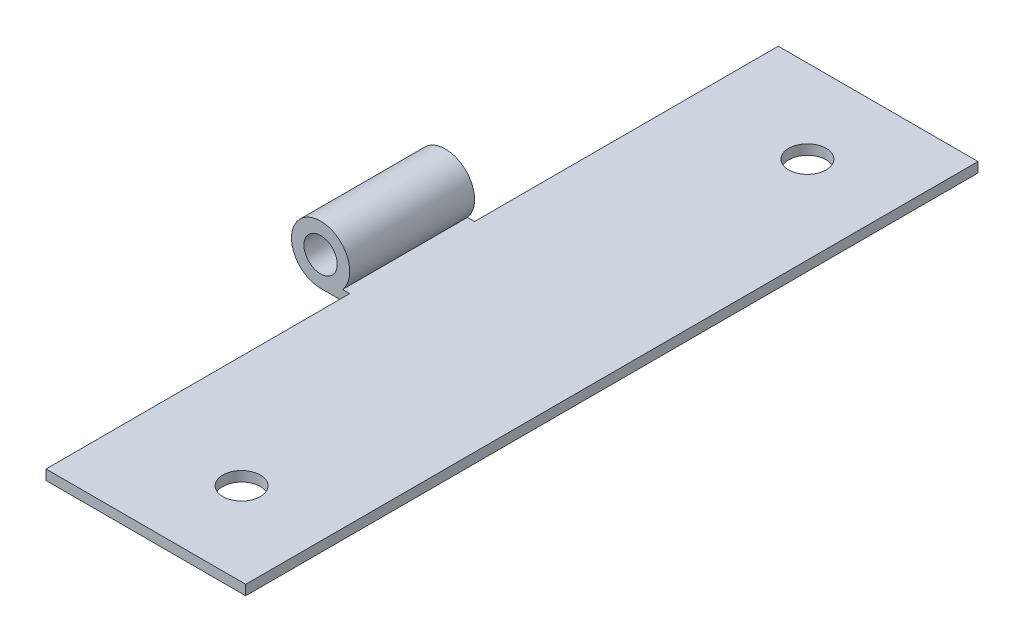
ISO-10303-21;
HEADER;
FILE_DESCRIPTION(('STEP AP214'),'2;1');
FILE_NAME('part.step','',(''),(''),'','','');
FILE_SCHEMA(('AUTOMOTIVE_DESIGN { 1 0 10303 214 1 1 1 1 }'));
ENDSEC;
DATA;
#1=APPLICATION_CONTEXT('core data for automotive mechanical design processes');
#2=APPLICATION_PROTOCOL_DEFINITION('international standard','automotive_design',2000,#1);
#3=PRODUCT_CONTEXT('',#1,'mechanical');
#4=PRODUCT('Part','Part','',(#3));
#5=PRODUCT_RELATED_PRODUCT_CATEGORY('part','',(#4));
#6=PRODUCT_DEFINITION_FORMATION('','',#4);
#7=PRODUCT_DEFINITION_CONTEXT('part definition',#1,'design');
#8=PRODUCT_DEFINITION('design','',#6,#7);
#9=PRODUCT_DEFINITION_SHAPE('','',#8);
#10=(LENGTH_UNIT() NAMED_UNIT(*) SI_UNIT(.MILLI.,.METRE.));
#11=(NAMED_UNIT(*) PLANE_ANGLE_UNIT() SI_UNIT($,.RADIAN.));
#12=(NAMED_UNIT(*) SI_UNIT($,.STERADIAN.) SOLID_ANGLE_UNIT());
#13=UNCERTAINTY_MEASURE_WITH_UNIT(LENGTH_MEASURE(1.E-05),#10,'distance_accuracy_value','');
#14=(GEOMETRIC_REPRESENTATION_CONTEXT(3) GLOBAL_UNCERTAINTY_ASSIGNED_CONTEXT((#13)) GLOBAL_UNIT_ASSIGNED_CONTEXT((#10,
#11,#12)) REPRESENTATION_CONTEXT('',''));
#15=CARTESIAN_POINT('',(0.,0.,0.));
#16=DIRECTION('',(0.,0.,1.));
#17=DIRECTION('',(1.,0.,0.));
#18=AXIS2_PLACEMENT_3D('',#15,#16,#17);
#19=CARTESIAN_POINT('',(-12.,1.2,44.));
#20=DIRECTION('',(1.,0.,0.));
#21=DIRECTION('',(0.,0.,-1.));
#22=AXIS2_PLACEMENT_3D('',#19,#20,#21);
#23=PLANE('',#22);
#24=DIRECTION('',(0.,1.,0.));
#25=VECTOR('',#24,1.);
#26=CARTESIAN_POINT('',(-12.,1.2,-7.5));
#27=LINE('',#26,#25);
#28=CARTESIAN_POINT('',(-12.,0.,-7.5));
#29=VERTEX_POINT('',#28);
#30=CARTESIAN_POINT('',(-12.,1.2,-7.5));
#31=VERTEX_POINT('',#30);
#32=EDGE_CURVE('E56',#29,#31,#27,.T.);
#33=ORIENTED_EDGE('',*,*,#32,.T.);
#34=DIRECTION('',(0.,0.,1.));
#35=VECTOR('',#34,1.);
#36=CARTESIAN_POINT('',(-12.,1.2,44.));
#37=LINE('',#36,#35);
#38=CARTESIAN_POINT('',(-12.,1.2,-44.));
#39=VERTEX_POINT('',#38);
#40=EDGE_CURVE('E143',#39,#31,#37,.T.);
#41=ORIENTED_EDGE('',*,*,#40,.F.);
#42=DIRECTION('',(0.,-1.,0.));
#43=VECTOR('',#42,1.);
#44=CARTESIAN_POINT('',(-12.,1.2,-44.));
#45=LINE('',#44,#43);
#46=CARTESIAN_POINT('',(-12.,0.,-44.));
#47=VERTEX_POINT('',#46);
#48=EDGE_CURVE('E41',#39,#47,#45,.T.);
#49=ORIENTED_EDGE('',*,*,#48,.T.);
#50=DIRECTION('',(0.,0.,1.));
#51=VECTOR('',#50,1.);
#52=CARTESIAN_POINT('',(-12.,0.,44.));
#53=LINE('',#52,#51);
#54=EDGE_CURVE('E153',#47,#29,#53,.T.);
#55=ORIENTED_EDGE('',*,*,#54,.T.);
#56=EDGE_LOOP('',(#33,#41,#49,#55));
#57=FACE_BOUND('',#56,.T.);
#58=ADVANCED_FACE('F33',(#57),#23,.F.);
#59=CARTESIAN_POINT('',(12.,1.2,44.));
#60=DIRECTION('',(-1.,0.,0.));
#61=DIRECTION('',(0.,0.,1.));
#62=AXIS2_PLACEMENT_3D('',#59,#60,#61);
#63=PLANE('',#62);
#64=DIRECTION('',(0.,0.,-1.));
#65=VECTOR('',#64,1.);
#66=CARTESIAN_POINT('',(12.,0.,44.));
#67=LINE('',#66,#65);
#68=CARTESIAN_POINT('',(12.,0.,44.));
#69=VERTEX_POINT('',#68);
#70=CARTESIAN_POINT('',(12.,0.,-44.));
#71=VERTEX_POINT('',#70);
#72=EDGE_CURVE('E118',#69,#71,#67,.T.);
#73=ORIENTED_EDGE('',*,*,#72,.T.);
#74=DIRECTION('',(0.,-1.,0.));
#75=VECTOR('',#74,1.);
#76=CARTESIAN_POINT('',(12.,1.2,-44.));
#77=LINE('',#76,#75);
#78=CARTESIAN_POINT('',(12.,1.2,-44.));
#79=VERTEX_POINT('',#78);
#80=EDGE_CURVE('E11',#79,#71,#77,.T.);
#81=ORIENTED_EDGE('',*,*,#80,.F.);
#82=DIRECTION('',(0.,0.,-1.));
#83=VECTOR('',#82,1.);
#84=CARTESIAN_POINT('',(12.,1.2,44.));
#85=LINE('',#84,#83);
#86=CARTESIAN_POINT('',(12.,1.2,44.));
#87=VERTEX_POINT('',#86);
#88=EDGE_CURVE('E138',#87,#79,#85,.T.);
#89=ORIENTED_EDGE('',*,*,#88,.F.);
#90=DIRECTION('',(0.,-1.,0.));
#91=VECTOR('',#90,1.);
#92=CARTESIAN_POINT('',(12.,1.2,44.));
#93=LINE('',#92,#91);
#94=EDGE_CURVE('E147',#87,#69,#93,.T.);
#95=ORIENTED_EDGE('',*,*,#94,.T.);
#96=EDGE_LOOP('',(#73,#81,#89,#95));
#97=FACE_BOUND('',#96,.T.);
#98=ADVANCED_FACE('F35',(#97),#63,.F.);
#99=CARTESIAN_POINT('',(-12.,1.2,-44.));
#100=DIRECTION('',(0.,0.,1.));
#101=DIRECTION('',(1.,0.,0.));
#102=AXIS2_PLACEMENT_3D('',#99,#100,#101);
#103=PLANE('',#102);
#104=DIRECTION('',(-1.,0.,0.));
#105=VECTOR('',#104,1.);
#106=CARTESIAN_POINT('',(-12.,0.,-44.));
#107=LINE('',#106,#105);
#108=EDGE_CURVE('E150',#71,#47,#107,.T.);
#109=ORIENTED_EDGE('',*,*,#108,.T.);
#110=ORIENTED_EDGE('',*,*,#48,.F.);
#111=DIRECTION('',(-1.,0.,0.));
#112=VECTOR('',#111,1.);
#113=CARTESIAN_POINT('',(-12.,1.2,-44.));
#114=LINE('',#113,#112);
#115=EDGE_CURVE('E140',#79,#39,#114,.T.);
#116=ORIENTED_EDGE('',*,*,#115,.F.);
#117=ORIENTED_EDGE('',*,*,#80,.T.);
#118=EDGE_LOOP('',(#109,#110,#116,#117));
#119=FACE_BOUND('',#118,.T.);
#120=ADVANCED_FACE('F222',(#119),#103,.F.);
#121=CARTESIAN_POINT('',(-12.,1.2,7.5));
#122=VERTEX_POINT('',#121);
#123=CARTESIAN_POINT('',(-12.,1.2,44.));
#124=VERTEX_POINT('',#123);
#125=EDGE_CURVE('E48',#122,#124,#37,.T.);
#126=ORIENTED_EDGE('',*,*,#125,.F.);
#127=DIRECTION('',(0.,1.,0.));
#128=VECTOR('',#127,1.);
#129=CARTESIAN_POINT('',(-12.,1.2,7.5));
#130=LINE('',#129,#128);
#131=CARTESIAN_POINT('',(-12.,0.,7.5));
#132=VERTEX_POINT('',#131);
#133=EDGE_CURVE('E107',#132,#122,#130,.T.);
#134=ORIENTED_EDGE('',*,*,#133,.F.);
#135=CARTESIAN_POINT('',(-12.,0.,44.));
#136=VERTEX_POINT('',#135);
#137=EDGE_CURVE('E152',#132,#136,#53,.T.);
#138=ORIENTED_EDGE('',*,*,#137,.T.);
#139=DIRECTION('',(0.,-1.,0.));
#140=VECTOR('',#139,1.);
#141=CARTESIAN_POINT('',(-12.,1.2,44.));
#142=LINE('',#141,#140);
#143=EDGE_CURVE('E158',#124,#136,#142,.T.);
#144=ORIENTED_EDGE('',*,*,#143,.F.);
#145=EDGE_LOOP('',(#126,#134,#138,#144));
#146=FACE_BOUND('',#145,.T.);
#147=ADVANCED_FACE('F218',(#146),#23,.F.);
#148=CARTESIAN_POINT('',(-12.,1.2,44.));
#149=DIRECTION('',(0.,0.,-1.));
#150=DIRECTION('',(-1.,0.,0.));
#151=AXIS2_PLACEMENT_3D('',#148,#149,#150);
#152=PLANE('',#151);
#153=DIRECTION('',(1.,0.,0.));
#154=VECTOR('',#153,1.);
#155=CARTESIAN_POINT('',(-12.,0.,44.));
#156=LINE('',#155,#154);
#157=EDGE_CURVE('E141',#136,#69,#156,.T.);
#158=ORIENTED_EDGE('',*,*,#157,.T.);
#159=ORIENTED_EDGE('',*,*,#94,.F.);
#160=DIRECTION('',(1.,0.,0.));
#161=VECTOR('',#160,1.);
#162=CARTESIAN_POINT('',(-12.,1.2,44.));
#163=LINE('',#162,#161);
#164=EDGE_CURVE('E145',#124,#87,#163,.T.);
#165=ORIENTED_EDGE('',*,*,#164,.F.);
#166=ORIENTED_EDGE('',*,*,#143,.T.);
#167=EDGE_LOOP('',(#158,#159,#165,#166));
#168=FACE_BOUND('',#167,.T.);
#169=ADVANCED_FACE('F198',(#168),#152,.F.);
#170=CARTESIAN_POINT('',(0.,1.2,0.));
#171=DIRECTION('',(0.,-1.,0.));
#172=DIRECTION('',(0.,0.,-1.));
#173=AXIS2_PLACEMENT_3D('',#170,#171,#172);
#174=PLANE('',#173);
#175=CARTESIAN_POINT('',(1.5,1.2,-34.));
#176=DIRECTION('',(0.,1.,0.));
#177=DIRECTION('',(0.,0.,1.));
#178=AXIS2_PLACEMENT_3D('',#175,#176,#177);
#179=CIRCLE('',#178,2.25);
#180=CARTESIAN_POINT('',(1.5,1.2,-31.75));
#181=VERTEX_POINT('',#180);
#182=EDGE_CURVE('E182',#181,#181,#179,.T.);
#183=ORIENTED_EDGE('',*,*,#182,.F.);
#184=EDGE_LOOP('',(#183));
#185=FACE_BOUND('',#184,.T.);
#186=CARTESIAN_POINT('',(1.5,1.2,34.));
#187=DIRECTION('',(0.,1.,0.));
#188=DIRECTION('',(0.,0.,-1.));
#189=AXIS2_PLACEMENT_3D('',#186,#187,#188);
#190=CIRCLE('',#189,2.25);
#191=CARTESIAN_POINT('',(1.5,1.2,31.75));
#192=VERTEX_POINT('',#191);
#193=EDGE_CURVE('E185',#192,#192,#190,.T.);
#194=ORIENTED_EDGE('',*,*,#193,.F.);
#195=EDGE_LOOP('',(#194));
#196=FACE_BOUND('',#195,.T.);
#197=ORIENTED_EDGE('',*,*,#88,.T.);
#198=ORIENTED_EDGE('',*,*,#115,.T.);
#199=ORIENTED_EDGE('',*,*,#40,.T.);
#200=DIRECTION('',(-1.,0.,0.));
#201=VECTOR('',#200,1.);
#202=CARTESIAN_POINT('',(-12.,1.2,-7.5));
#203=LINE('',#202,#201);
#204=CARTESIAN_POINT('',(-12.8618188083454,1.2,-7.5));
#205=VERTEX_POINT('',#204);
#206=EDGE_CURVE('E115',#31,#205,#203,.T.);
#207=ORIENTED_EDGE('',*,*,#206,.T.);
#208=DIRECTION('',(0.,0.,-1.));
#209=VECTOR('',#208,1.);
#210=CARTESIAN_POINT('',(-12.8618188083454,1.2,7.5));
#211=LINE('',#210,#209);
#212=CARTESIAN_POINT('',(-12.8618188083454,1.2,7.5));
#213=VERTEX_POINT('',#212);
#214=EDGE_CURVE('E111',#213,#205,#211,.T.);
#215=ORIENTED_EDGE('',*,*,#214,.F.);
#216=DIRECTION('',(-1.,0.,0.));
#217=VECTOR('',#216,1.);
#218=CARTESIAN_POINT('',(-12.,1.2,7.5));
#219=LINE('',#218,#217);
#220=EDGE_CURVE('E99',#122,#213,#219,.T.);
#221=ORIENTED_EDGE('',*,*,#220,.F.);
#222=ORIENTED_EDGE('',*,*,#125,.T.);
#223=ORIENTED_EDGE('',*,*,#164,.T.);
#224=EDGE_LOOP('',(#197,#198,#199,#207,#215,#221,#222,#223));
#225=FACE_BOUND('',#224,.T.);
#226=ADVANCED_FACE('F113',(#185,#196,#225),#174,.F.);
#227=CARTESIAN_POINT('',(0.,0.,0.));
#228=DIRECTION('',(0.,-1.,0.));
#229=DIRECTION('',(0.,0.,-1.));
#230=AXIS2_PLACEMENT_3D('',#227,#228,#229);
#231=PLANE('',#230);
#232=CARTESIAN_POINT('',(1.5,0.,-34.));
#233=DIRECTION('',(0.,1.,0.));
#234=DIRECTION('',(0.,0.,1.));
#235=AXIS2_PLACEMENT_3D('',#232,#233,#234);
#236=CIRCLE('',#235,2.25);
#237=CARTESIAN_POINT('',(1.5,0.,-31.75));
#238=VERTEX_POINT('',#237);
#239=EDGE_CURVE('E177',#238,#238,#236,.T.);
#240=ORIENTED_EDGE('',*,*,#239,.T.);
#241=EDGE_LOOP('',(#240));
#242=FACE_BOUND('',#241,.T.);
#243=CARTESIAN_POINT('',(1.5,0.,34.));
#244=DIRECTION('',(0.,1.,0.));
#245=DIRECTION('',(0.,0.,-1.));
#246=AXIS2_PLACEMENT_3D('',#243,#244,#245);
#247=CIRCLE('',#246,2.25);
#248=CARTESIAN_POINT('',(1.5,0.,31.75));
#249=VERTEX_POINT('',#248);
#250=EDGE_CURVE('E188',#249,#249,#247,.T.);
#251=ORIENTED_EDGE('',*,*,#250,.T.);
#252=EDGE_LOOP('',(#251));
#253=FACE_BOUND('',#252,.T.);
#254=ORIENTED_EDGE('',*,*,#72,.F.);
#255=ORIENTED_EDGE('',*,*,#157,.F.);
#256=ORIENTED_EDGE('',*,*,#137,.F.);
#257=DIRECTION('',(1.,0.,0.));
#258=VECTOR('',#257,1.);
#259=CARTESIAN_POINT('',(-12.,0.,7.5));
#260=LINE('',#259,#258);
#261=CARTESIAN_POINT('',(-15.5,0.,7.5));
#262=VERTEX_POINT('',#261);
#263=EDGE_CURVE('E124',#262,#132,#260,.T.);
#264=ORIENTED_EDGE('',*,*,#263,.F.);
#265=DIRECTION('',(0.,0.,-1.));
#266=VECTOR('',#265,1.);
#267=CARTESIAN_POINT('',(-15.5,0.,7.5));
#268=LINE('',#267,#266);
#269=CARTESIAN_POINT('',(-15.5,0.,-7.5));
#270=VERTEX_POINT('',#269);
#271=EDGE_CURVE('E119',#262,#270,#268,.T.);
#272=ORIENTED_EDGE('',*,*,#271,.T.);
#273=DIRECTION('',(1.,0.,0.));
#274=VECTOR('',#273,1.);
#275=CARTESIAN_POINT('',(-12.,0.,-7.5));
#276=LINE('',#275,#274);
#277=EDGE_CURVE('E134',#270,#29,#276,.T.);
#278=ORIENTED_EDGE('',*,*,#277,.T.);
#279=ORIENTED_EDGE('',*,*,#54,.F.);
#280=ORIENTED_EDGE('',*,*,#108,.F.);
#281=EDGE_LOOP('',(#254,#255,#256,#264,#272,#278,#279,#280));
#282=FACE_BOUND('',#281,.T.);
#283=ADVANCED_FACE('F166',(#242,#253,#282),#231,.T.);
#284=CARTESIAN_POINT('',(-15.5,3.5,7.5));
#285=DIRECTION('',(0.,0.,1.));
#286=DIRECTION('',(1.,0.,0.));
#287=AXIS2_PLACEMENT_3D('',#284,#285,#286);
#288=PLANE('',#287);
#289=ORIENTED_EDGE('',*,*,#133,.T.);
#290=ORIENTED_EDGE('',*,*,#220,.T.);
#291=CARTESIAN_POINT('',(-15.5,3.5,7.5));
#292=DIRECTION('',(0.,0.,1.));
#293=DIRECTION('',(1.,0.,0.));
#294=AXIS2_PLACEMENT_3D('',#291,#292,#293);
#295=CIRCLE('',#294,3.5);
#296=EDGE_CURVE('E105',#213,#262,#295,.T.);
#297=ORIENTED_EDGE('',*,*,#296,.T.);
#298=ORIENTED_EDGE('',*,*,#263,.T.);
#299=EDGE_LOOP('',(#289,#290,#297,#298));
#300=FACE_BOUND('',#299,.T.);
#301=CARTESIAN_POINT('',(-15.5,3.5,7.5));
#302=DIRECTION('',(0.,0.,1.));
#303=DIRECTION('',(1.,0.,0.));
#304=AXIS2_PLACEMENT_3D('',#301,#302,#303);
#305=CIRCLE('',#304,2.);
#306=CARTESIAN_POINT('',(-13.5,3.5,7.5));
#307=VERTEX_POINT('',#306);
#308=EDGE_CURVE('E130',#307,#307,#305,.T.);
#309=ORIENTED_EDGE('',*,*,#308,.F.);
#310=EDGE_LOOP('',(#309));
#311=FACE_BOUND('',#310,.T.);
#312=ADVANCED_FACE('F101',(#300,#311),#288,.T.);
#313=CARTESIAN_POINT('',(-15.5,3.5,-7.5));
#314=DIRECTION('',(0.,0.,1.));
#315=DIRECTION('',(1.,0.,0.));
#316=AXIS2_PLACEMENT_3D('',#313,#314,#315);
#317=PLANE('',#316);
#318=ORIENTED_EDGE('',*,*,#32,.F.);
#319=ORIENTED_EDGE('',*,*,#277,.F.);
#320=CARTESIAN_POINT('',(-15.5,3.5,-7.5));
#321=DIRECTION('',(0.,0.,1.));
#322=DIRECTION('',(1.,0.,0.));
#323=AXIS2_PLACEMENT_3D('',#320,#321,#322);
#324=CIRCLE('',#323,3.5);
#325=EDGE_CURVE('E132',#205,#270,#324,.T.);
#326=ORIENTED_EDGE('',*,*,#325,.F.);
#327=ORIENTED_EDGE('',*,*,#206,.F.);
#328=EDGE_LOOP('',(#318,#319,#326,#327));
#329=FACE_BOUND('',#328,.T.);
#330=CARTESIAN_POINT('',(-15.5,3.5,-7.5));
#331=DIRECTION('',(0.,0.,1.));
#332=DIRECTION('',(1.,0.,0.));
#333=AXIS2_PLACEMENT_3D('',#330,#331,#332);
#334=CIRCLE('',#333,2.);
#335=CARTESIAN_POINT('',(-13.5,3.5,-7.5));
#336=VERTEX_POINT('',#335);
#337=EDGE_CURVE('E175',#336,#336,#334,.T.);
#338=ORIENTED_EDGE('',*,*,#337,.T.);
#339=EDGE_LOOP('',(#338));
#340=FACE_BOUND('',#339,.T.);
#341=ADVANCED_FACE('F169',(#329,#340),#317,.F.);
#342=CARTESIAN_POINT('',(-15.5,3.5,7.5));
#343=DIRECTION('',(0.,0.,-1.));
#344=DIRECTION('',(-1.,0.,0.));
#345=AXIS2_PLACEMENT_3D('',#342,#343,#344);
#346=CYLINDRICAL_SURFACE('',#345,3.5);
#347=ORIENTED_EDGE('',*,*,#325,.T.);
#348=ORIENTED_EDGE('',*,*,#271,.F.);
#349=ORIENTED_EDGE('',*,*,#296,.F.);
#350=ORIENTED_EDGE('',*,*,#214,.T.);
#351=EDGE_LOOP('',(#347,#348,#349,#350));
#352=FACE_BOUND('',#351,.T.);
#353=ADVANCED_FACE('F121',(#352),#346,.T.);
#354=CARTESIAN_POINT('',(-15.5,3.5,7.5));
#355=DIRECTION('',(0.,0.,-1.));
#356=DIRECTION('',(-1.,0.,0.));
#357=AXIS2_PLACEMENT_3D('',#354,#355,#356);
#358=CYLINDRICAL_SURFACE('',#357,2.);
#359=ORIENTED_EDGE('',*,*,#308,.T.);
#360=EDGE_LOOP('',(#359));
#361=FACE_BOUND('',#360,.T.);
#362=ORIENTED_EDGE('',*,*,#337,.F.);
#363=EDGE_LOOP('',(#362));
#364=FACE_BOUND('',#363,.T.);
#365=ADVANCED_FACE('F204',(#361,#364),#358,.F.);
#366=CARTESIAN_POINT('',(1.5,0.,34.));
#367=DIRECTION('',(0.,1.,0.));
#368=DIRECTION('',(0.,0.,1.));
#369=AXIS2_PLACEMENT_3D('',#366,#367,#368);
#370=CYLINDRICAL_SURFACE('',#369,2.25);
#371=ORIENTED_EDGE('',*,*,#250,.F.);
#372=EDGE_LOOP('',(#371));
#373=FACE_BOUND('',#372,.T.);
#374=ORIENTED_EDGE('',*,*,#193,.T.);
#375=EDGE_LOOP('',(#374));
#376=FACE_BOUND('',#375,.T.);
#377=ADVANCED_FACE('F202',(#373,#376),#370,.F.);
#378=CARTESIAN_POINT('',(1.5,0.,-34.));
#379=DIRECTION('',(0.,1.,0.));
#380=DIRECTION('',(0.,0.,1.));
#381=AXIS2_PLACEMENT_3D('',#378,#379,#380);
#382=CYLINDRICAL_SURFACE('',#381,2.25);
#383=ORIENTED_EDGE('',*,*,#239,.F.);
#384=EDGE_LOOP('',(#383));
#385=FACE_BOUND('',#384,.T.);
#386=ORIENTED_EDGE('',*,*,#182,.T.);
#387=EDGE_LOOP('',(#386));
#388=FACE_BOUND('',#387,.T.);
#389=ADVANCED_FACE('F194',(#385,#388),#382,.F.);
#390=CLOSED_SHELL('',(#58,#98,#120,#147,#169,#226,#283,#312,#341,#353,#365,#377,#389));
#391=MANIFOLD_SOLID_BREP('B2',#390);
#392=ADVANCED_BREP_SHAPE_REPRESENTATION('',(#18,#391),#14);
#393=SHAPE_DEFINITION_REPRESENTATION(#9,#392);
ENDSEC;
END-ISO-10303-21;
